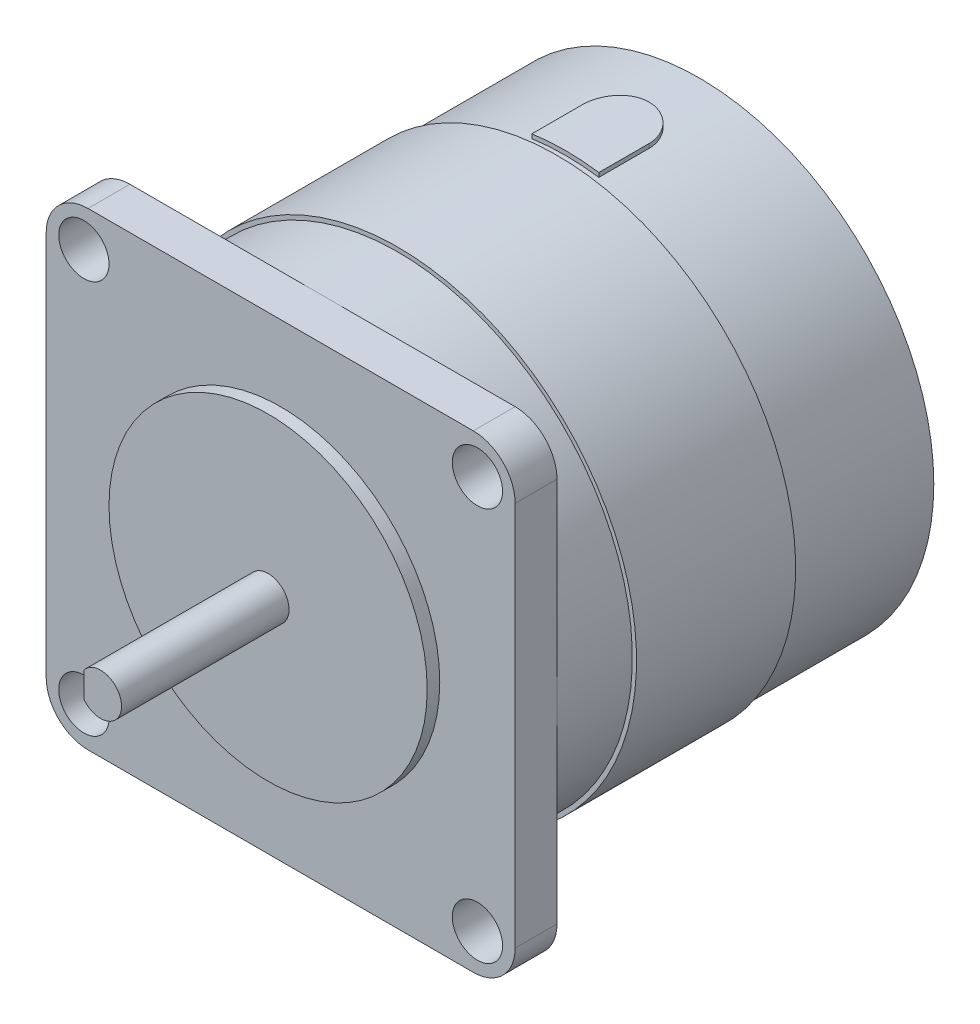
ISO-10303-21;
HEADER;
FILE_DESCRIPTION(('STEP AP214'),'2;1');
FILE_NAME('part.step','',(''),(''),'','','');
FILE_SCHEMA(('AUTOMOTIVE_DESIGN { 1 0 10303 214 1 1 1 1 }'));
ENDSEC;
DATA;
#1=APPLICATION_CONTEXT('core data for automotive mechanical design processes');
#2=APPLICATION_PROTOCOL_DEFINITION('international standard','automotive_design',2000,#1);
#3=PRODUCT_CONTEXT('',#1,'mechanical');
#4=PRODUCT('Part','Part','',(#3));
#5=PRODUCT_RELATED_PRODUCT_CATEGORY('part','',(#4));
#6=PRODUCT_DEFINITION_FORMATION('','',#4);
#7=PRODUCT_DEFINITION_CONTEXT('part definition',#1,'design');
#8=PRODUCT_DEFINITION('design','',#6,#7);
#9=PRODUCT_DEFINITION_SHAPE('','',#8);
#10=(LENGTH_UNIT() NAMED_UNIT(*) SI_UNIT(.MILLI.,.METRE.));
#11=(NAMED_UNIT(*) PLANE_ANGLE_UNIT() SI_UNIT($,.RADIAN.));
#12=(NAMED_UNIT(*) SI_UNIT($,.STERADIAN.) SOLID_ANGLE_UNIT());
#13=UNCERTAINTY_MEASURE_WITH_UNIT(LENGTH_MEASURE(1.E-05),#10,'distance_accuracy_value','');
#14=(GEOMETRIC_REPRESENTATION_CONTEXT(3) GLOBAL_UNCERTAINTY_ASSIGNED_CONTEXT((#13)) GLOBAL_UNIT_ASSIGNED_CONTEXT((#10,
#11,#12)) REPRESENTATION_CONTEXT('',''));
#15=CARTESIAN_POINT('',(0.,0.,0.));
#16=DIRECTION('',(0.,0.,1.));
#17=DIRECTION('',(1.,0.,0.));
#18=AXIS2_PLACEMENT_3D('',#15,#16,#17);
#19=CARTESIAN_POINT('',(0.,0.,45.));
#20=DIRECTION('',(0.,0.,-1.));
#21=DIRECTION('',(-1.,0.,0.));
#22=AXIS2_PLACEMENT_3D('',#19,#20,#21);
#23=CYLINDRICAL_SURFACE('',#22,28.);
#24=CARTESIAN_POINT('',(0.,0.,17.));
#25=DIRECTION('',(0.,0.,1.));
#26=DIRECTION('',(1.,0.,0.));
#27=AXIS2_PLACEMENT_3D('',#24,#25,#26);
#28=CIRCLE('',#27,28.);
#29=CARTESIAN_POINT('',(28.,0.,17.));
#30=VERTEX_POINT('',#29);
#31=EDGE_CURVE('E242',#30,#30,#28,.T.);
#32=ORIENTED_EDGE('',*,*,#31,.F.);
#33=EDGE_LOOP('',(#32));
#34=FACE_BOUND('',#33,.T.);
#35=CARTESIAN_POINT('',(0.,0.,0.));
#36=DIRECTION('',(0.,0.,1.));
#37=DIRECTION('',(1.,0.,0.));
#38=AXIS2_PLACEMENT_3D('',#35,#36,#37);
#39=CIRCLE('',#38,28.);
#40=CARTESIAN_POINT('',(28.,0.,0.));
#41=VERTEX_POINT('',#40);
#42=EDGE_CURVE('E254',#41,#41,#39,.T.);
#43=ORIENTED_EDGE('',*,*,#42,.T.);
#44=EDGE_LOOP('',(#43));
#45=FACE_BOUND('',#44,.T.);
#46=CARTESIAN_POINT('',(0.,28.,6.));
#47=CARTESIAN_POINT('',(-0.223461458825642,27.9999965409153,6.00000930635524));
#48=CARTESIAN_POINT('',(-0.447055621982067,27.9972968080118,6.0187888286376));
#49=CARTESIAN_POINT('',(-0.888002641472323,27.9867868202351,6.09339654493597));
#50=CARTESIAN_POINT('',(-1.10534906213391,27.9789714798523,6.14926160708152));
#51=CARTESIAN_POINT('',(-1.52735470714177,27.9591092064729,6.29634424693691));
#52=CARTESIAN_POINT('',(-1.73202307739908,27.9470653667318,6.38753598730602));
#53=CARTESIAN_POINT('',(-2.12311860096127,27.9200795632234,6.60262217158142));
#54=CARTESIAN_POINT('',(-2.3095484617546,27.9051380306009,6.72651175139832));
#55=CARTESIAN_POINT('',(-2.66023460158925,27.8739015648356,7.00441668466906));
#56=CARTESIAN_POINT('',(-2.8243423632026,27.8575986306991,7.15861857143165));
#57=CARTESIAN_POINT('',(-3.12444516707451,27.8255399928487,7.49236965815862));
#58=CARTESIAN_POINT('',(-3.26043865083479,27.8097843195122,7.67192026238608));
#59=CARTESIAN_POINT('',(-3.50102350568891,27.7805262596274,8.05226046421501));
#60=CARTESIAN_POINT('',(-3.60547250189553,27.7670342079851,8.25314098514061));
#61=CARTESIAN_POINT('',(-3.77909380667239,27.7439393062515,8.66981815796421));
#62=CARTESIAN_POINT('',(-3.84826785817993,27.7343362640087,8.88561407229329));
#63=CARTESIAN_POINT('',(-3.94891728024467,27.7201847750637,9.32444003931207));
#64=CARTESIAN_POINT('',(-3.98064595411181,27.7156023809441,9.54741087971129));
#65=CARTESIAN_POINT('',(-4.00628840030274,27.7119077538169,9.99555562173919));
#66=CARTESIAN_POINT('',(-4.00020414507916,27.7127952354817,10.2207294078429));
#67=CARTESIAN_POINT('',(-3.95060072391764,27.7199090308412,10.6651061813323));
#68=CARTESIAN_POINT('',(-3.90736272718597,27.7260952440848,10.8843412881834));
#69=CARTESIAN_POINT('',(-3.78511889285714,27.7430468675803,11.312412345137));
#70=CARTESIAN_POINT('',(-3.70611212989925,27.7538123963016,11.5212480260447));
#71=CARTESIAN_POINT('',(-3.51427808499815,27.7787543094111,11.9234530924337));
#72=CARTESIAN_POINT('',(-3.40133077246536,27.7929427632502,12.1167644495432));
#73=CARTESIAN_POINT('',(-3.14490738288152,27.8231229556026,12.4817968487572));
#74=CARTESIAN_POINT('',(-3.00142948605021,27.8391148015806,12.6535166029198));
#75=CARTESIAN_POINT('',(-2.68646983485756,27.871277427218,12.9721216124585));
#76=CARTESIAN_POINT('',(-2.51474615031044,27.8874485153813,13.1187677802398));
#77=CARTESIAN_POINT('',(-2.14899663760356,27.9180127158238,13.381194004893));
#78=CARTESIAN_POINT('',(-1.95497072748996,27.932405821569,13.4969739483359));
#79=CARTESIAN_POINT('',(-1.54992415925538,27.9578054125388,13.6943897499972));
#80=CARTESIAN_POINT('',(-1.33889491093462,27.9688101722408,13.7760082189885));
#81=CARTESIAN_POINT('',(-0.90593339750839,27.9861783978407,13.902581877279));
#82=CARTESIAN_POINT('',(-0.684001801262564,27.9925421480863,13.9475393127636));
#83=CARTESIAN_POINT('',(-0.237600044779892,27.9998738914547,13.9991992536409));
#84=CARTESIAN_POINT('',(-0.013168679084783,28.0008882724896,14.006230652937));
#85=CARTESIAN_POINT('',(0.43366970062659,27.997532945354,13.9827103839598));
#86=CARTESIAN_POINT('',(0.656076771152115,27.9931633879463,13.9521597680698));
#87=CARTESIAN_POINT('',(1.09156483596897,27.979559874646,13.8546161168106));
#88=CARTESIAN_POINT('',(1.30468220984024,27.9703471746018,13.7877822816409));
#89=CARTESIAN_POINT('',(1.71668588804936,27.9480874854487,13.6197365214092));
#90=CARTESIAN_POINT('',(1.91557157816216,27.9350403309726,13.5185231136417));
#91=CARTESIAN_POINT('',(2.29491939159571,27.9064475434187,13.2838123660251));
#92=CARTESIAN_POINT('',(2.47525042539594,27.8908858969841,13.1501051405891));
#93=CARTESIAN_POINT('',(2.81103058960972,27.8590489286155,12.8544958478955));
#94=CARTESIAN_POINT('',(2.96647841415716,27.8427735692829,12.6925923018307));
#95=CARTESIAN_POINT('',(3.24926729241534,27.8111976033941,12.3437265980711));
#96=CARTESIAN_POINT('',(3.37638860169675,27.7959052309702,12.156585459399));
#97=CARTESIAN_POINT('',(3.59739137507829,27.7681694296162,11.763413626792));
#98=CARTESIAN_POINT('',(3.69127367010166,27.7557259294716,11.5573834052168));
#99=CARTESIAN_POINT('',(3.84278821517066,27.7351554052352,11.1329533909874));
#100=CARTESIAN_POINT('',(3.90053860263941,27.7270143275847,10.9145964823174));
#101=CARTESIAN_POINT('',(3.97852746400306,27.7159321852887,10.4711588778888));
#102=CARTESIAN_POINT('',(3.99876826786038,27.7129907976574,10.2460786006446));
#103=CARTESIAN_POINT('',(4.00111180748421,27.7126523549015,9.79777234695742));
#104=CARTESIAN_POINT('',(3.98355994735612,27.7152050864635,9.57454813668937));
#105=CARTESIAN_POINT('',(3.91155391701599,27.7254584842396,9.13425975188307));
#106=CARTESIAN_POINT('',(3.85709978482701,27.7331591451494,8.91719557099794));
#107=CARTESIAN_POINT('',(3.71295291131592,27.7528237895503,8.49546946977763));
#108=CARTESIAN_POINT('',(3.62328205925203,27.7647851243538,8.29079993647391));
#109=CARTESIAN_POINT('',(3.41128128406175,27.7916269145477,7.89935511009318));
#110=CARTESIAN_POINT('',(3.28895046383679,27.8065074501192,7.71258030873721));
#111=CARTESIAN_POINT('',(3.0138389492619,27.8376732530578,7.36046836294217));
#112=CARTESIAN_POINT('',(2.8608018588073,27.853969645273,7.19533250959552));
#113=CARTESIAN_POINT('',(2.5291630266423,27.8860364410813,6.89296058513554));
#114=CARTESIAN_POINT('',(2.35055532866988,27.9018067210666,6.75573103242301));
#115=CARTESIAN_POINT('',(1.97180684906769,27.9311332498513,6.51246485592771));
#116=CARTESIAN_POINT('',(1.7715634349086,27.9446781023906,6.40658669168421));
#117=CARTESIAN_POINT('',(1.35604257674007,27.9679151214977,6.2301205119878));
#118=CARTESIAN_POINT('',(1.14078121039796,27.9776113360616,6.15949539713523));
#119=CARTESIAN_POINT('',(0.770422727995114,27.9898072601009,6.07183282617475));
#120=CARTESIAN_POINT('',(0.617627798357146,27.9936102171292,6.04493592612351));
#121=CARTESIAN_POINT('',(0.309909842731325,27.9987077731558,6.00901638182359));
#122=CARTESIAN_POINT('',(0.154986839646123,28.0000023991278,5.99999354536305));
#123=CARTESIAN_POINT('',(0.,28.,6.));
#124=B_SPLINE_CURVE_WITH_KNOTS('',3,(#46,#47,#48,#49,#50,#51,#52,#53,#54,#55,#56,#57,#58,#59,
#60,#61,#62,#63,#64,#65,#66,#67,#68,#69,#70,#71,#72,#73,#74,#75,#76,#77,#78,#79,#80,#81,#82,#83,
#84,#85,#86,#87,#88,#89,#90,#91,#92,#93,#94,#95,#96,#97,#98,#99,#100,#101,#102,#103,#104,#105,
#106,#107,#108,#109,#110,#111,#112,#113,#114,#115,#116,#117,#118,#119,#120,#121,#122,#123),
.UNSPECIFIED.,.T.,.F.,(4,2,2,2,2,2,2,2,2,2,2,2,2,2,2,2,2,2,2,2,2,2,2,2,2,2,2,2,2,2,2,2,2,2,2,2,
2,2,4),(0.,0.669818106705754,1.34030310398334,2.01029864278741,2.68019457002068,
3.35434973715227,4.02854226565975,4.7057337617023,5.38289179442632,6.05544237283908,
6.72795786899117,7.39542833159442,8.06291606306981,8.73279271243798,9.40270930109858,
10.0786951341339,10.7546834512892,11.4310154497532,12.107306006905,12.7777222417217,
13.4481197037612,14.1155991547388,14.7831073960998,15.4550475197326,16.1270228951033,
16.8040424944938,17.4810451682605,18.155822574817,18.830558065187,19.4991530369424,
20.1677473197976,20.8359266881017,21.5041244117341,22.1781529501895,22.8523387489822,
23.5298760999862,24.2066989169227,24.6712716823152,25.1358394518162),.UNSPECIFIED.);
#125=CARTESIAN_POINT('',(4.,27.712812921102,9.99999999999999));
#126=VERTEX_POINT('',#125);
#127=CARTESIAN_POINT('',(-4.,27.712812921102,9.99999999999999));
#128=VERTEX_POINT('',#127);
#129=EDGE_CURVE('E12',#126,#128,#124,.T.);
#130=ORIENTED_EDGE('',*,*,#129,.F.);
#131=DIRECTION('',(0.,0.,-1.));
#132=VECTOR('',#131,1.);
#133=CARTESIAN_POINT('',(4.,27.712812921102,45.));
#134=LINE('',#133,#132);
#135=CARTESIAN_POINT('',(4.,27.712812921102,16.));
#136=VERTEX_POINT('',#135);
#137=EDGE_CURVE('E53',#136,#126,#134,.T.);
#138=ORIENTED_EDGE('',*,*,#137,.F.);
#139=CARTESIAN_POINT('',(0.,0.,16.));
#140=DIRECTION('',(0.,0.,-1.));
#141=DIRECTION('',(-1.,0.,0.));
#142=AXIS2_PLACEMENT_3D('',#139,#140,#141);
#143=CIRCLE('',#142,28.);
#144=CARTESIAN_POINT('',(-4.,27.712812921102,16.));
#145=VERTEX_POINT('',#144);
#146=EDGE_CURVE('E314',#145,#136,#143,.T.);
#147=ORIENTED_EDGE('',*,*,#146,.F.);
#148=DIRECTION('',(0.,0.,-1.));
#149=VECTOR('',#148,1.);
#150=CARTESIAN_POINT('',(-4.,27.712812921102,45.));
#151=LINE('',#150,#149);
#152=EDGE_CURVE('E310',#128,#145,#151,.F.);
#153=ORIENTED_EDGE('',*,*,#152,.F.);
#154=EDGE_LOOP('',(#130,#138,#147,#153));
#155=FACE_BOUND('',#154,.T.);
#156=ADVANCED_FACE('F40',(#34,#45,#155),#23,.T.);
#157=CARTESIAN_POINT('',(0.,0.,51.5));
#158=DIRECTION('',(0.,0.,1.));
#159=DIRECTION('',(1.,0.,0.));
#160=AXIS2_PLACEMENT_3D('',#157,#158,#159);
#161=PLANE('',#160);
#162=CARTESIAN_POINT('',(0.,0.,51.5));
#163=DIRECTION('',(0.,0.,1.));
#164=DIRECTION('',(1.,0.,0.));
#165=AXIS2_PLACEMENT_3D('',#162,#163,#164);
#166=CIRCLE('',#165,19.);
#167=CARTESIAN_POINT('',(19.,0.,51.5));
#168=VERTEX_POINT('',#167);
#169=EDGE_CURVE('E323',#168,#168,#166,.T.);
#170=ORIENTED_EDGE('',*,*,#169,.T.);
#171=EDGE_LOOP('',(#170));
#172=FACE_BOUND('',#171,.T.);
#173=CARTESIAN_POINT('',(0.,0.,51.5));
#174=DIRECTION('',(0.,0.,1.));
#175=DIRECTION('',(1.,0.,0.));
#176=AXIS2_PLACEMENT_3D('',#173,#174,#175);
#177=CIRCLE('',#176,2.5);
#178=CARTESIAN_POINT('',(2.5,0.,51.5));
#179=VERTEX_POINT('',#178);
#180=EDGE_CURVE('E377',#179,#179,#177,.T.);
#181=ORIENTED_EDGE('',*,*,#180,.F.);
#182=EDGE_LOOP('',(#181));
#183=FACE_BOUND('',#182,.T.);
#184=ADVANCED_FACE('F203',(#172,#183),#161,.T.);
#185=CARTESIAN_POINT('',(28.,-28.,50.));
#186=DIRECTION('',(0.,0.,1.));
#187=DIRECTION('',(1.,0.,0.));
#188=AXIS2_PLACEMENT_3D('',#185,#186,#187);
#189=PLANE('',#188);
#190=DIRECTION('',(0.,-1.,0.));
#191=VECTOR('',#190,1.);
#192=CARTESIAN_POINT('',(-28.,28.,50.));
#193=LINE('',#192,#191);
#194=CARTESIAN_POINT('',(-28.,23.,50.));
#195=VERTEX_POINT('',#194);
#196=CARTESIAN_POINT('',(-28.,-23.,50.));
#197=VERTEX_POINT('',#196);
#198=EDGE_CURVE('E329',#195,#197,#193,.T.);
#199=ORIENTED_EDGE('',*,*,#198,.T.);
#200=CARTESIAN_POINT('',(-23.,-23.,50.));
#201=DIRECTION('',(0.,0.,1.));
#202=DIRECTION('',(1.,0.,0.));
#203=AXIS2_PLACEMENT_3D('',#200,#201,#202);
#204=CIRCLE('',#203,5.);
#205=CARTESIAN_POINT('',(-23.,-28.,50.));
#206=VERTEX_POINT('',#205);
#207=EDGE_CURVE('E285',#197,#206,#204,.T.);
#208=ORIENTED_EDGE('',*,*,#207,.T.);
#209=DIRECTION('',(1.,0.,0.));
#210=VECTOR('',#209,1.);
#211=CARTESIAN_POINT('',(-28.,-28.,50.));
#212=LINE('',#211,#210);
#213=CARTESIAN_POINT('',(23.,-28.,50.));
#214=VERTEX_POINT('',#213);
#215=EDGE_CURVE('E331',#206,#214,#212,.T.);
#216=ORIENTED_EDGE('',*,*,#215,.T.);
#217=CARTESIAN_POINT('',(23.,-23.,50.));
#218=DIRECTION('',(0.,0.,1.));
#219=DIRECTION('',(1.,0.,0.));
#220=AXIS2_PLACEMENT_3D('',#217,#218,#219);
#221=CIRCLE('',#220,5.);
#222=CARTESIAN_POINT('',(28.,-23.,50.));
#223=VERTEX_POINT('',#222);
#224=EDGE_CURVE('E282',#214,#223,#221,.T.);
#225=ORIENTED_EDGE('',*,*,#224,.T.);
#226=DIRECTION('',(0.,1.,0.));
#227=VECTOR('',#226,1.);
#228=CARTESIAN_POINT('',(28.,28.,50.));
#229=LINE('',#228,#227);
#230=CARTESIAN_POINT('',(28.,23.,50.));
#231=VERTEX_POINT('',#230);
#232=EDGE_CURVE('E344',#223,#231,#229,.T.);
#233=ORIENTED_EDGE('',*,*,#232,.T.);
#234=CARTESIAN_POINT('',(23.,23.,50.));
#235=DIRECTION('',(0.,0.,1.));
#236=DIRECTION('',(1.,0.,0.));
#237=AXIS2_PLACEMENT_3D('',#234,#235,#236);
#238=CIRCLE('',#237,5.);
#239=CARTESIAN_POINT('',(23.,28.,50.));
#240=VERTEX_POINT('',#239);
#241=EDGE_CURVE('E279',#231,#240,#238,.T.);
#242=ORIENTED_EDGE('',*,*,#241,.T.);
#243=DIRECTION('',(-1.,0.,0.));
#244=VECTOR('',#243,1.);
#245=CARTESIAN_POINT('',(-28.,28.,50.));
#246=LINE('',#245,#244);
#247=CARTESIAN_POINT('',(-23.,28.,50.));
#248=VERTEX_POINT('',#247);
#249=EDGE_CURVE('E332',#240,#248,#246,.T.);
#250=ORIENTED_EDGE('',*,*,#249,.T.);
#251=CARTESIAN_POINT('',(-23.,23.,50.));
#252=DIRECTION('',(0.,0.,1.));
#253=DIRECTION('',(1.,0.,0.));
#254=AXIS2_PLACEMENT_3D('',#251,#252,#253);
#255=CIRCLE('',#254,5.);
#256=EDGE_CURVE('E276',#248,#195,#255,.T.);
#257=ORIENTED_EDGE('',*,*,#256,.T.);
#258=EDGE_LOOP('',(#199,#208,#216,#225,#233,#242,#250,#257));
#259=FACE_BOUND('',#258,.T.);
#260=CARTESIAN_POINT('',(-23.5,23.5,50.));
#261=DIRECTION('',(0.,0.,1.));
#262=DIRECTION('',(1.,0.,0.));
#263=AXIS2_PLACEMENT_3D('',#260,#261,#262);
#264=CIRCLE('',#263,3.);
#265=CARTESIAN_POINT('',(-20.5,23.5,50.));
#266=VERTEX_POINT('',#265);
#267=EDGE_CURVE('E367',#266,#266,#264,.T.);
#268=ORIENTED_EDGE('',*,*,#267,.F.);
#269=EDGE_LOOP('',(#268));
#270=FACE_BOUND('',#269,.T.);
#271=CARTESIAN_POINT('',(23.5,23.5,50.));
#272=DIRECTION('',(0.,0.,1.));
#273=DIRECTION('',(1.,0.,0.));
#274=AXIS2_PLACEMENT_3D('',#271,#272,#273);
#275=CIRCLE('',#274,3.);
#276=CARTESIAN_POINT('',(26.5,23.5,50.));
#277=VERTEX_POINT('',#276);
#278=EDGE_CURVE('E341',#277,#277,#275,.T.);
#279=ORIENTED_EDGE('',*,*,#278,.F.);
#280=EDGE_LOOP('',(#279));
#281=FACE_BOUND('',#280,.T.);
#282=CARTESIAN_POINT('',(-23.5,-23.5,50.));
#283=DIRECTION('',(0.,0.,1.));
#284=DIRECTION('',(1.,0.,0.));
#285=AXIS2_PLACEMENT_3D('',#282,#283,#284);
#286=CIRCLE('',#285,3.);
#287=CARTESIAN_POINT('',(-20.5,-23.5,50.));
#288=VERTEX_POINT('',#287);
#289=EDGE_CURVE('E342',#288,#288,#286,.T.);
#290=ORIENTED_EDGE('',*,*,#289,.F.);
#291=EDGE_LOOP('',(#290));
#292=FACE_BOUND('',#291,.T.);
#293=CARTESIAN_POINT('',(23.5,-23.5,50.));
#294=DIRECTION('',(0.,0.,1.));
#295=DIRECTION('',(1.,0.,0.));
#296=AXIS2_PLACEMENT_3D('',#293,#294,#295);
#297=CIRCLE('',#296,3.);
#298=CARTESIAN_POINT('',(26.5,-23.5,50.));
#299=VERTEX_POINT('',#298);
#300=EDGE_CURVE('E319',#299,#299,#297,.T.);
#301=ORIENTED_EDGE('',*,*,#300,.F.);
#302=EDGE_LOOP('',(#301));
#303=FACE_BOUND('',#302,.T.);
#304=CARTESIAN_POINT('',(0.,0.,50.));
#305=DIRECTION('',(0.,0.,1.));
#306=DIRECTION('',(1.,0.,0.));
#307=AXIS2_PLACEMENT_3D('',#304,#305,#306);
#308=CIRCLE('',#307,19.);
#309=CARTESIAN_POINT('',(19.,0.,50.));
#310=VERTEX_POINT('',#309);
#311=EDGE_CURVE('E354',#310,#310,#308,.T.);
#312=ORIENTED_EDGE('',*,*,#311,.F.);
#313=EDGE_LOOP('',(#312));
#314=FACE_BOUND('',#313,.T.);
#315=ADVANCED_FACE('F209',(#259,#270,#281,#292,#303,#314),#189,.T.);
#316=CARTESIAN_POINT('',(0.,0.,45.));
#317=DIRECTION('',(0.,0.,1.));
#318=DIRECTION('',(1.,0.,0.));
#319=AXIS2_PLACEMENT_3D('',#316,#317,#318);
#320=CIRCLE('',#319,28.);
#321=CARTESIAN_POINT('',(28.,0.,45.));
#322=VERTEX_POINT('',#321);
#323=CARTESIAN_POINT('',(0.,28.,45.));
#324=VERTEX_POINT('',#323);
#325=EDGE_CURVE('E235',#322,#324,#320,.T.);
#326=ORIENTED_EDGE('',*,*,#325,.F.);
#327=CARTESIAN_POINT('',(0.,-28.,45.));
#328=VERTEX_POINT('',#327);
#329=EDGE_CURVE('E252',#328,#322,#320,.T.);
#330=ORIENTED_EDGE('',*,*,#329,.F.);
#331=CARTESIAN_POINT('',(-28.,0.,45.));
#332=VERTEX_POINT('',#331);
#333=EDGE_CURVE('E326',#332,#328,#320,.T.);
#334=ORIENTED_EDGE('',*,*,#333,.F.);
#335=EDGE_CURVE('E250',#324,#332,#320,.T.);
#336=ORIENTED_EDGE('',*,*,#335,.F.);
#337=EDGE_LOOP('',(#326,#330,#334,#336));
#338=FACE_BOUND('',#337,.T.);
#339=CARTESIAN_POINT('',(0.,0.,36.));
#340=DIRECTION('',(0.,0.,-1.));
#341=DIRECTION('',(-1.,0.,0.));
#342=AXIS2_PLACEMENT_3D('',#339,#340,#341);
#343=CIRCLE('',#342,28.);
#344=CARTESIAN_POINT('',(-28.,0.,36.));
#345=VERTEX_POINT('',#344);
#346=EDGE_CURVE('E239',#345,#345,#343,.T.);
#347=ORIENTED_EDGE('',*,*,#346,.F.);
#348=EDGE_LOOP('',(#347));
#349=FACE_BOUND('',#348,.T.);
#350=ADVANCED_FACE('F205',(#338,#349),#23,.T.);
#351=CARTESIAN_POINT('',(28.,-28.,45.));
#352=DIRECTION('',(0.,0.,1.));
#353=DIRECTION('',(1.,0.,0.));
#354=AXIS2_PLACEMENT_3D('',#351,#352,#353);
#355=PLANE('',#354);
#356=CARTESIAN_POINT('',(23.5,23.5,45.));
#357=DIRECTION('',(0.,0.,1.));
#358=DIRECTION('',(1.,0.,0.));
#359=AXIS2_PLACEMENT_3D('',#356,#357,#358);
#360=CIRCLE('',#359,3.);
#361=CARTESIAN_POINT('',(26.5,23.5,45.));
#362=VERTEX_POINT('',#361);
#363=EDGE_CURVE('E364',#362,#362,#360,.T.);
#364=ORIENTED_EDGE('',*,*,#363,.T.);
#365=EDGE_LOOP('',(#364));
#366=FACE_BOUND('',#365,.T.);
#367=DIRECTION('',(-1.,0.,0.));
#368=VECTOR('',#367,1.);
#369=CARTESIAN_POINT('',(-28.,28.,45.));
#370=LINE('',#369,#368);
#371=CARTESIAN_POINT('',(23.,28.,45.));
#372=VERTEX_POINT('',#371);
#373=EDGE_CURVE('E391',#372,#324,#370,.T.);
#374=ORIENTED_EDGE('',*,*,#373,.F.);
#375=CARTESIAN_POINT('',(23.,23.,45.));
#376=DIRECTION('',(0.,0.,1.));
#377=DIRECTION('',(1.,0.,0.));
#378=AXIS2_PLACEMENT_3D('',#375,#376,#377);
#379=CIRCLE('',#378,5.);
#380=CARTESIAN_POINT('',(28.,23.,45.));
#381=VERTEX_POINT('',#380);
#382=EDGE_CURVE('E304',#372,#381,#379,.F.);
#383=ORIENTED_EDGE('',*,*,#382,.T.);
#384=DIRECTION('',(0.,1.,0.));
#385=VECTOR('',#384,1.);
#386=CARTESIAN_POINT('',(28.,28.,45.));
#387=LINE('',#386,#385);
#388=EDGE_CURVE('E372',#322,#381,#387,.T.);
#389=ORIENTED_EDGE('',*,*,#388,.F.);
#390=ORIENTED_EDGE('',*,*,#325,.T.);
#391=EDGE_LOOP('',(#374,#383,#389,#390));
#392=FACE_BOUND('',#391,.T.);
#393=ADVANCED_FACE('F218',(#366,#392),#355,.F.);
#394=CARTESIAN_POINT('',(-23.5,23.5,45.));
#395=DIRECTION('',(0.,0.,1.));
#396=DIRECTION('',(1.,0.,0.));
#397=AXIS2_PLACEMENT_3D('',#394,#395,#396);
#398=CIRCLE('',#397,3.);
#399=CARTESIAN_POINT('',(-20.5,23.5,45.));
#400=VERTEX_POINT('',#399);
#401=EDGE_CURVE('E381',#400,#400,#398,.T.);
#402=ORIENTED_EDGE('',*,*,#401,.T.);
#403=EDGE_LOOP('',(#402));
#404=FACE_BOUND('',#403,.T.);
#405=DIRECTION('',(0.,-1.,0.));
#406=VECTOR('',#405,1.);
#407=CARTESIAN_POINT('',(-28.,28.,45.));
#408=LINE('',#407,#406);
#409=CARTESIAN_POINT('',(-28.,23.,45.));
#410=VERTEX_POINT('',#409);
#411=EDGE_CURVE('E352',#410,#332,#408,.T.);
#412=ORIENTED_EDGE('',*,*,#411,.F.);
#413=CARTESIAN_POINT('',(-23.,23.,45.));
#414=DIRECTION('',(0.,0.,1.));
#415=DIRECTION('',(1.,0.,0.));
#416=AXIS2_PLACEMENT_3D('',#413,#414,#415);
#417=CIRCLE('',#416,5.);
#418=CARTESIAN_POINT('',(-23.,28.,45.));
#419=VERTEX_POINT('',#418);
#420=EDGE_CURVE('E307',#410,#419,#417,.F.);
#421=ORIENTED_EDGE('',*,*,#420,.T.);
#422=EDGE_CURVE('E371',#324,#419,#370,.T.);
#423=ORIENTED_EDGE('',*,*,#422,.F.);
#424=ORIENTED_EDGE('',*,*,#335,.T.);
#425=EDGE_LOOP('',(#412,#421,#423,#424));
#426=FACE_BOUND('',#425,.T.);
#427=ADVANCED_FACE('F224',(#404,#426),#355,.F.);
#428=CARTESIAN_POINT('',(-23.5,-23.5,45.));
#429=DIRECTION('',(0.,0.,1.));
#430=DIRECTION('',(1.,0.,0.));
#431=AXIS2_PLACEMENT_3D('',#428,#429,#430);
#432=CIRCLE('',#431,3.);
#433=CARTESIAN_POINT('',(-20.5,-23.5,45.));
#434=VERTEX_POINT('',#433);
#435=EDGE_CURVE('E338',#434,#434,#432,.T.);
#436=ORIENTED_EDGE('',*,*,#435,.T.);
#437=EDGE_LOOP('',(#436));
#438=FACE_BOUND('',#437,.T.);
#439=DIRECTION('',(1.,0.,0.));
#440=VECTOR('',#439,1.);
#441=CARTESIAN_POINT('',(-28.,-28.,45.));
#442=LINE('',#441,#440);
#443=CARTESIAN_POINT('',(-23.,-28.,45.));
#444=VERTEX_POINT('',#443);
#445=EDGE_CURVE('E347',#444,#328,#442,.T.);
#446=ORIENTED_EDGE('',*,*,#445,.F.);
#447=CARTESIAN_POINT('',(-23.,-23.,45.));
#448=DIRECTION('',(0.,0.,1.));
#449=DIRECTION('',(1.,0.,0.));
#450=AXIS2_PLACEMENT_3D('',#447,#448,#449);
#451=CIRCLE('',#450,5.);
#452=CARTESIAN_POINT('',(-28.,-23.,45.));
#453=VERTEX_POINT('',#452);
#454=EDGE_CURVE('E266',#444,#453,#451,.F.);
#455=ORIENTED_EDGE('',*,*,#454,.T.);
#456=EDGE_CURVE('E388',#332,#453,#408,.T.);
#457=ORIENTED_EDGE('',*,*,#456,.F.);
#458=ORIENTED_EDGE('',*,*,#333,.T.);
#459=EDGE_LOOP('',(#446,#455,#457,#458));
#460=FACE_BOUND('',#459,.T.);
#461=ADVANCED_FACE('F445',(#438,#460),#355,.F.);
#462=CARTESIAN_POINT('',(23.5,-23.5,45.));
#463=DIRECTION('',(0.,0.,1.));
#464=DIRECTION('',(1.,0.,0.));
#465=AXIS2_PLACEMENT_3D('',#462,#463,#464);
#466=CIRCLE('',#465,3.);
#467=CARTESIAN_POINT('',(26.5,-23.5,45.));
#468=VERTEX_POINT('',#467);
#469=EDGE_CURVE('E407',#468,#468,#466,.T.);
#470=ORIENTED_EDGE('',*,*,#469,.T.);
#471=EDGE_LOOP('',(#470));
#472=FACE_BOUND('',#471,.T.);
#473=CARTESIAN_POINT('',(28.,-23.,45.));
#474=VERTEX_POINT('',#473);
#475=EDGE_CURVE('E369',#474,#322,#387,.T.);
#476=ORIENTED_EDGE('',*,*,#475,.F.);
#477=CARTESIAN_POINT('',(23.,-23.,45.));
#478=DIRECTION('',(0.,0.,1.));
#479=DIRECTION('',(1.,0.,0.));
#480=AXIS2_PLACEMENT_3D('',#477,#478,#479);
#481=CIRCLE('',#480,5.);
#482=CARTESIAN_POINT('',(23.,-28.,45.));
#483=VERTEX_POINT('',#482);
#484=EDGE_CURVE('E294',#474,#483,#481,.F.);
#485=ORIENTED_EDGE('',*,*,#484,.T.);
#486=EDGE_CURVE('E349',#328,#483,#442,.T.);
#487=ORIENTED_EDGE('',*,*,#486,.F.);
#488=ORIENTED_EDGE('',*,*,#329,.T.);
#489=EDGE_LOOP('',(#476,#485,#487,#488));
#490=FACE_BOUND('',#489,.T.);
#491=ADVANCED_FACE('F227',(#472,#490),#355,.F.);
#492=CARTESIAN_POINT('',(28.,28.,50.));
#493=DIRECTION('',(-1.,0.,0.));
#494=DIRECTION('',(0.,-1.,0.));
#495=AXIS2_PLACEMENT_3D('',#492,#493,#494);
#496=PLANE('',#495);
#497=ORIENTED_EDGE('',*,*,#232,.F.);
#498=DIRECTION('',(0.,0.,-1.));
#499=VECTOR('',#498,1.);
#500=CARTESIAN_POINT('',(28.,-23.,50.));
#501=LINE('',#500,#499);
#502=EDGE_CURVE('E290',#223,#474,#501,.T.);
#503=ORIENTED_EDGE('',*,*,#502,.T.);
#504=ORIENTED_EDGE('',*,*,#475,.T.);
#505=ORIENTED_EDGE('',*,*,#388,.T.);
#506=DIRECTION('',(0.,0.,-1.));
#507=VECTOR('',#506,1.);
#508=CARTESIAN_POINT('',(28.,23.,50.));
#509=LINE('',#508,#507);
#510=EDGE_CURVE('E287',#381,#231,#509,.F.);
#511=ORIENTED_EDGE('',*,*,#510,.T.);
#512=EDGE_LOOP('',(#497,#503,#504,#505,#511));
#513=FACE_BOUND('',#512,.T.);
#514=ADVANCED_FACE('F452',(#513),#496,.F.);
#515=CARTESIAN_POINT('',(-28.,28.,50.));
#516=DIRECTION('',(0.,-1.,0.));
#517=DIRECTION('',(0.,0.,-1.));
#518=AXIS2_PLACEMENT_3D('',#515,#516,#517);
#519=PLANE('',#518);
#520=ORIENTED_EDGE('',*,*,#249,.F.);
#521=DIRECTION('',(0.,0.,-1.));
#522=VECTOR('',#521,1.);
#523=CARTESIAN_POINT('',(23.,28.,50.));
#524=LINE('',#523,#522);
#525=EDGE_CURVE('E300',#240,#372,#524,.T.);
#526=ORIENTED_EDGE('',*,*,#525,.T.);
#527=ORIENTED_EDGE('',*,*,#373,.T.);
#528=ORIENTED_EDGE('',*,*,#422,.T.);
#529=DIRECTION('',(0.,0.,-1.));
#530=VECTOR('',#529,1.);
#531=CARTESIAN_POINT('',(-23.,28.,50.));
#532=LINE('',#531,#530);
#533=EDGE_CURVE('E297',#419,#248,#532,.F.);
#534=ORIENTED_EDGE('',*,*,#533,.T.);
#535=EDGE_LOOP('',(#520,#526,#527,#528,#534));
#536=FACE_BOUND('',#535,.T.);
#537=ADVANCED_FACE('F462',(#536),#519,.F.);
#538=CARTESIAN_POINT('',(-28.,28.,50.));
#539=DIRECTION('',(1.,0.,0.));
#540=DIRECTION('',(0.,1.,0.));
#541=AXIS2_PLACEMENT_3D('',#538,#539,#540);
#542=PLANE('',#541);
#543=ORIENTED_EDGE('',*,*,#456,.T.);
#544=DIRECTION('',(0.,0.,-1.));
#545=VECTOR('',#544,1.);
#546=CARTESIAN_POINT('',(-28.,-23.,50.));
#547=LINE('',#546,#545);
#548=EDGE_CURVE('E273',#453,#197,#547,.F.);
#549=ORIENTED_EDGE('',*,*,#548,.T.);
#550=ORIENTED_EDGE('',*,*,#198,.F.);
#551=DIRECTION('',(0.,0.,-1.));
#552=VECTOR('',#551,1.);
#553=CARTESIAN_POINT('',(-28.,23.,50.));
#554=LINE('',#553,#552);
#555=EDGE_CURVE('E269',#195,#410,#554,.T.);
#556=ORIENTED_EDGE('',*,*,#555,.T.);
#557=ORIENTED_EDGE('',*,*,#411,.T.);
#558=EDGE_LOOP('',(#543,#549,#550,#556,#557));
#559=FACE_BOUND('',#558,.T.);
#560=ADVANCED_FACE('F535',(#559),#542,.F.);
#561=CARTESIAN_POINT('',(-28.,-28.,50.));
#562=DIRECTION('',(0.,1.,0.));
#563=DIRECTION('',(0.,0.,1.));
#564=AXIS2_PLACEMENT_3D('',#561,#562,#563);
#565=PLANE('',#564);
#566=ORIENTED_EDGE('',*,*,#215,.F.);
#567=DIRECTION('',(0.,0.,-1.));
#568=VECTOR('',#567,1.);
#569=CARTESIAN_POINT('',(-23.,-28.,50.));
#570=LINE('',#569,#568);
#571=EDGE_CURVE('E262',#206,#444,#570,.T.);
#572=ORIENTED_EDGE('',*,*,#571,.T.);
#573=ORIENTED_EDGE('',*,*,#445,.T.);
#574=ORIENTED_EDGE('',*,*,#486,.T.);
#575=DIRECTION('',(0.,0.,-1.));
#576=VECTOR('',#575,1.);
#577=CARTESIAN_POINT('',(23.,-28.,50.));
#578=LINE('',#577,#576);
#579=EDGE_CURVE('E259',#483,#214,#578,.F.);
#580=ORIENTED_EDGE('',*,*,#579,.T.);
#581=EDGE_LOOP('',(#566,#572,#573,#574,#580));
#582=FACE_BOUND('',#581,.T.);
#583=ADVANCED_FACE('F435',(#582),#565,.F.);
#584=CARTESIAN_POINT('',(-23.5,23.5,45.));
#585=DIRECTION('',(0.,0.,1.));
#586=DIRECTION('',(1.,0.,0.));
#587=AXIS2_PLACEMENT_3D('',#584,#585,#586);
#588=CYLINDRICAL_SURFACE('',#587,3.);
#589=ORIENTED_EDGE('',*,*,#401,.F.);
#590=EDGE_LOOP('',(#589));
#591=FACE_BOUND('',#590,.T.);
#592=ORIENTED_EDGE('',*,*,#267,.T.);
#593=EDGE_LOOP('',(#592));
#594=FACE_BOUND('',#593,.T.);
#595=ADVANCED_FACE('F528',(#591,#594),#588,.F.);
#596=CARTESIAN_POINT('',(23.5,23.5,45.));
#597=DIRECTION('',(0.,0.,1.));
#598=DIRECTION('',(1.,0.,0.));
#599=AXIS2_PLACEMENT_3D('',#596,#597,#598);
#600=CYLINDRICAL_SURFACE('',#599,3.);
#601=ORIENTED_EDGE('',*,*,#363,.F.);
#602=EDGE_LOOP('',(#601));
#603=FACE_BOUND('',#602,.T.);
#604=ORIENTED_EDGE('',*,*,#278,.T.);
#605=EDGE_LOOP('',(#604));
#606=FACE_BOUND('',#605,.T.);
#607=ADVANCED_FACE('F524',(#603,#606),#600,.F.);
#608=CARTESIAN_POINT('',(-23.5,-23.5,45.));
#609=DIRECTION('',(0.,0.,1.));
#610=DIRECTION('',(1.,0.,0.));
#611=AXIS2_PLACEMENT_3D('',#608,#609,#610);
#612=CYLINDRICAL_SURFACE('',#611,3.);
#613=ORIENTED_EDGE('',*,*,#435,.F.);
#614=EDGE_LOOP('',(#613));
#615=FACE_BOUND('',#614,.T.);
#616=ORIENTED_EDGE('',*,*,#289,.T.);
#617=EDGE_LOOP('',(#616));
#618=FACE_BOUND('',#617,.T.);
#619=ADVANCED_FACE('F520',(#615,#618),#612,.F.);
#620=CARTESIAN_POINT('',(23.5,-23.5,45.));
#621=DIRECTION('',(0.,0.,1.));
#622=DIRECTION('',(1.,0.,0.));
#623=AXIS2_PLACEMENT_3D('',#620,#621,#622);
#624=CYLINDRICAL_SURFACE('',#623,3.);
#625=ORIENTED_EDGE('',*,*,#469,.F.);
#626=EDGE_LOOP('',(#625));
#627=FACE_BOUND('',#626,.T.);
#628=ORIENTED_EDGE('',*,*,#300,.T.);
#629=EDGE_LOOP('',(#628));
#630=FACE_BOUND('',#629,.T.);
#631=ADVANCED_FACE('F516',(#627,#630),#624,.F.);
#632=CARTESIAN_POINT('',(0.,0.,0.));
#633=DIRECTION('',(0.,0.,-1.));
#634=DIRECTION('',(-1.,0.,0.));
#635=AXIS2_PLACEMENT_3D('',#632,#633,#634);
#636=CYLINDRICAL_SURFACE('',#635,28.5);
#637=CARTESIAN_POINT('',(0.,0.,17.));
#638=DIRECTION('',(0.,0.,-1.));
#639=DIRECTION('',(-1.,0.,0.));
#640=AXIS2_PLACEMENT_3D('',#637,#638,#639);
#641=CIRCLE('',#640,28.5);
#642=CARTESIAN_POINT('',(-28.5,0.,17.));
#643=VERTEX_POINT('',#642);
#644=EDGE_CURVE('E322',#643,#643,#641,.T.);
#645=ORIENTED_EDGE('',*,*,#644,.F.);
#646=EDGE_LOOP('',(#645));
#647=FACE_BOUND('',#646,.T.);
#648=CARTESIAN_POINT('',(0.,0.,36.));
#649=DIRECTION('',(0.,0.,-1.));
#650=DIRECTION('',(-1.,0.,0.));
#651=AXIS2_PLACEMENT_3D('',#648,#649,#650);
#652=CIRCLE('',#651,28.5);
#653=CARTESIAN_POINT('',(-28.5,0.,36.));
#654=VERTEX_POINT('',#653);
#655=EDGE_CURVE('E320',#654,#654,#652,.T.);
#656=ORIENTED_EDGE('',*,*,#655,.T.);
#657=EDGE_LOOP('',(#656));
#658=FACE_BOUND('',#657,.T.);
#659=ADVANCED_FACE('F512',(#647,#658),#636,.T.);
#660=CARTESIAN_POINT('',(28.5,0.,17.));
#661=DIRECTION('',(0.,0.,1.));
#662=DIRECTION('',(1.,0.,0.));
#663=AXIS2_PLACEMENT_3D('',#660,#661,#662);
#664=PLANE('',#663);
#665=ORIENTED_EDGE('',*,*,#31,.T.);
#666=EDGE_LOOP('',(#665));
#667=FACE_BOUND('',#666,.T.);
#668=ORIENTED_EDGE('',*,*,#644,.T.);
#669=EDGE_LOOP('',(#668));
#670=FACE_BOUND('',#669,.T.);
#671=ADVANCED_FACE('F508',(#667,#670),#664,.F.);
#672=CARTESIAN_POINT('',(28.5,0.,36.));
#673=DIRECTION('',(0.,0.,-1.));
#674=DIRECTION('',(-1.,0.,0.));
#675=AXIS2_PLACEMENT_3D('',#672,#673,#674);
#676=PLANE('',#675);
#677=ORIENTED_EDGE('',*,*,#655,.F.);
#678=EDGE_LOOP('',(#677));
#679=FACE_BOUND('',#678,.T.);
#680=ORIENTED_EDGE('',*,*,#346,.T.);
#681=EDGE_LOOP('',(#680));
#682=FACE_BOUND('',#681,.T.);
#683=ADVANCED_FACE('F505',(#679,#682),#676,.F.);
#684=CARTESIAN_POINT('',(0.,0.,0.));
#685=DIRECTION('',(0.,0.,1.));
#686=DIRECTION('',(1.,0.,0.));
#687=AXIS2_PLACEMENT_3D('',#684,#685,#686);
#688=PLANE('',#687);
#689=ORIENTED_EDGE('',*,*,#42,.F.);
#690=EDGE_LOOP('',(#689));
#691=FACE_BOUND('',#690,.T.);
#692=ADVANCED_FACE('F503',(#691),#688,.F.);
#693=CARTESIAN_POINT('',(0.,0.,51.5));
#694=DIRECTION('',(0.,0.,-1.));
#695=DIRECTION('',(-1.,0.,0.));
#696=AXIS2_PLACEMENT_3D('',#693,#694,#695);
#697=CYLINDRICAL_SURFACE('',#696,19.);
#698=ORIENTED_EDGE('',*,*,#169,.F.);
#699=EDGE_LOOP('',(#698));
#700=FACE_BOUND('',#699,.T.);
#701=ORIENTED_EDGE('',*,*,#311,.T.);
#702=EDGE_LOOP('',(#701));
#703=FACE_BOUND('',#702,.T.);
#704=ADVANCED_FACE('F498',(#700,#703),#697,.T.);
#705=CARTESIAN_POINT('',(0.,0.,71.5));
#706=DIRECTION('',(0.,0.,-1.));
#707=DIRECTION('',(-1.,0.,0.));
#708=AXIS2_PLACEMENT_3D('',#705,#706,#707);
#709=CYLINDRICAL_SURFACE('',#708,2.5);
#710=CARTESIAN_POINT('',(0.,0.,71.5));
#711=DIRECTION('',(0.,0.,1.));
#712=DIRECTION('',(1.,0.,0.));
#713=AXIS2_PLACEMENT_3D('',#710,#711,#712);
#714=CIRCLE('',#713,2.5);
#715=CARTESIAN_POINT('',(-2.,-1.5,71.5));
#716=VERTEX_POINT('',#715);
#717=CARTESIAN_POINT('',(-2.,1.5,71.5));
#718=VERTEX_POINT('',#717);
#719=EDGE_CURVE('E356',#716,#718,#714,.T.);
#720=ORIENTED_EDGE('',*,*,#719,.F.);
#721=DIRECTION('',(0.,0.,1.));
#722=VECTOR('',#721,1.);
#723=CARTESIAN_POINT('',(-2.,-1.5,61.5));
#724=LINE('',#723,#722);
#725=CARTESIAN_POINT('',(-2.,-1.5,61.5));
#726=VERTEX_POINT('',#725);
#727=EDGE_CURVE('E396',#726,#716,#724,.T.);
#728=ORIENTED_EDGE('',*,*,#727,.F.);
#729=CARTESIAN_POINT('',(0.,0.,61.5));
#730=DIRECTION('',(0.,0.,-1.));
#731=DIRECTION('',(-1.,0.,0.));
#732=AXIS2_PLACEMENT_3D('',#729,#730,#731);
#733=CIRCLE('',#732,2.5);
#734=CARTESIAN_POINT('',(-2.,1.5,61.5));
#735=VERTEX_POINT('',#734);
#736=EDGE_CURVE('E248',#726,#735,#733,.T.);
#737=ORIENTED_EDGE('',*,*,#736,.T.);
#738=DIRECTION('',(0.,0.,1.));
#739=VECTOR('',#738,1.);
#740=CARTESIAN_POINT('',(-2.,1.5,61.5));
#741=LINE('',#740,#739);
#742=EDGE_CURVE('E386',#735,#718,#741,.T.);
#743=ORIENTED_EDGE('',*,*,#742,.T.);
#744=EDGE_LOOP('',(#720,#728,#737,#743));
#745=FACE_BOUND('',#744,.T.);
#746=ORIENTED_EDGE('',*,*,#180,.T.);
#747=EDGE_LOOP('',(#746));
#748=FACE_BOUND('',#747,.T.);
#749=ADVANCED_FACE('F495',(#745,#748),#709,.T.);
#750=CARTESIAN_POINT('',(0.,0.,71.5));
#751=DIRECTION('',(0.,0.,1.));
#752=DIRECTION('',(1.,0.,0.));
#753=AXIS2_PLACEMENT_3D('',#750,#751,#752);
#754=PLANE('',#753);
#755=DIRECTION('',(0.,1.,0.));
#756=VECTOR('',#755,1.);
#757=CARTESIAN_POINT('',(-2.,1.5,71.5));
#758=LINE('',#757,#756);
#759=EDGE_CURVE('E387',#716,#718,#758,.T.);
#760=ORIENTED_EDGE('',*,*,#759,.F.);
#761=ORIENTED_EDGE('',*,*,#719,.T.);
#762=EDGE_LOOP('',(#760,#761));
#763=FACE_BOUND('',#762,.T.);
#764=ADVANCED_FACE('F487',(#763),#754,.T.);
#765=CARTESIAN_POINT('',(-2.,-1.5,61.5));
#766=DIRECTION('',(0.,0.,-1.));
#767=DIRECTION('',(-1.,0.,0.));
#768=AXIS2_PLACEMENT_3D('',#765,#766,#767);
#769=PLANE('',#768);
#770=DIRECTION('',(0.,1.,0.));
#771=VECTOR('',#770,1.);
#772=CARTESIAN_POINT('',(-2.,1.5,61.5));
#773=LINE('',#772,#771);
#774=EDGE_CURVE('E189',#726,#735,#773,.T.);
#775=ORIENTED_EDGE('',*,*,#774,.T.);
#776=ORIENTED_EDGE('',*,*,#736,.F.);
#777=EDGE_LOOP('',(#775,#776));
#778=FACE_BOUND('',#777,.T.);
#779=ADVANCED_FACE('F483',(#778),#769,.F.);
#780=CARTESIAN_POINT('',(-2.,1.5,61.5));
#781=DIRECTION('',(1.,0.,0.));
#782=DIRECTION('',(0.,0.,-1.));
#783=AXIS2_PLACEMENT_3D('',#780,#781,#782);
#784=PLANE('',#783);
#785=ORIENTED_EDGE('',*,*,#759,.T.);
#786=ORIENTED_EDGE('',*,*,#742,.F.);
#787=ORIENTED_EDGE('',*,*,#774,.F.);
#788=ORIENTED_EDGE('',*,*,#727,.T.);
#789=EDGE_LOOP('',(#785,#786,#787,#788));
#790=FACE_BOUND('',#789,.T.);
#791=ADVANCED_FACE('F486',(#790),#784,.F.);
#792=CARTESIAN_POINT('',(-23.,-23.,50.));
#793=DIRECTION('',(0.,0.,-1.));
#794=DIRECTION('',(-1.,0.,0.));
#795=AXIS2_PLACEMENT_3D('',#792,#793,#794);
#796=CYLINDRICAL_SURFACE('',#795,5.);
#797=ORIENTED_EDGE('',*,*,#207,.F.);
#798=ORIENTED_EDGE('',*,*,#548,.F.);
#799=ORIENTED_EDGE('',*,*,#454,.F.);
#800=ORIENTED_EDGE('',*,*,#571,.F.);
#801=EDGE_LOOP('',(#797,#798,#799,#800));
#802=FACE_BOUND('',#801,.T.);
#803=ADVANCED_FACE('F491',(#802),#796,.T.);
#804=CARTESIAN_POINT('',(23.,-23.,50.));
#805=DIRECTION('',(0.,0.,-1.));
#806=DIRECTION('',(-1.,0.,0.));
#807=AXIS2_PLACEMENT_3D('',#804,#805,#806);
#808=CYLINDRICAL_SURFACE('',#807,5.);
#809=ORIENTED_EDGE('',*,*,#224,.F.);
#810=ORIENTED_EDGE('',*,*,#579,.F.);
#811=ORIENTED_EDGE('',*,*,#484,.F.);
#812=ORIENTED_EDGE('',*,*,#502,.F.);
#813=EDGE_LOOP('',(#809,#810,#811,#812));
#814=FACE_BOUND('',#813,.T.);
#815=ADVANCED_FACE('F449',(#814),#808,.T.);
#816=CARTESIAN_POINT('',(23.,23.,50.));
#817=DIRECTION('',(0.,0.,-1.));
#818=DIRECTION('',(-1.,0.,0.));
#819=AXIS2_PLACEMENT_3D('',#816,#817,#818);
#820=CYLINDRICAL_SURFACE('',#819,5.);
#821=ORIENTED_EDGE('',*,*,#241,.F.);
#822=ORIENTED_EDGE('',*,*,#510,.F.);
#823=ORIENTED_EDGE('',*,*,#382,.F.);
#824=ORIENTED_EDGE('',*,*,#525,.F.);
#825=EDGE_LOOP('',(#821,#822,#823,#824));
#826=FACE_BOUND('',#825,.T.);
#827=ADVANCED_FACE('F459',(#826),#820,.T.);
#828=CARTESIAN_POINT('',(-23.,23.,50.));
#829=DIRECTION('',(0.,0.,-1.));
#830=DIRECTION('',(-1.,0.,0.));
#831=AXIS2_PLACEMENT_3D('',#828,#829,#830);
#832=CYLINDRICAL_SURFACE('',#831,5.);
#833=ORIENTED_EDGE('',*,*,#256,.F.);
#834=ORIENTED_EDGE('',*,*,#533,.F.);
#835=ORIENTED_EDGE('',*,*,#420,.F.);
#836=ORIENTED_EDGE('',*,*,#555,.F.);
#837=EDGE_LOOP('',(#833,#834,#835,#836));
#838=FACE_BOUND('',#837,.T.);
#839=ADVANCED_FACE('F42',(#838),#832,.T.);
#840=CARTESIAN_POINT('',(0.,29.501,10.));
#841=DIRECTION('',(0.,-1.,0.));
#842=DIRECTION('',(0.,0.,-1.));
#843=AXIS2_PLACEMENT_3D('',#840,#841,#842);
#844=CYLINDRICAL_SURFACE('',#843,4.);
#845=DIRECTION('',(0.,-1.,0.));
#846=VECTOR('',#845,1.);
#847=CARTESIAN_POINT('',(4.,29.501,10.));
#848=LINE('',#847,#846);
#849=CARTESIAN_POINT('',(4.,28.2179021190449,10.));
#850=VERTEX_POINT('',#849);
#851=EDGE_CURVE('E166',#850,#126,#848,.T.);
#852=ORIENTED_EDGE('',*,*,#851,.T.);
#853=ORIENTED_EDGE('',*,*,#129,.T.);
#854=DIRECTION('',(0.,-1.,0.));
#855=VECTOR('',#854,1.);
#856=CARTESIAN_POINT('',(-4.,29.501,10.));
#857=LINE('',#856,#855);
#858=CARTESIAN_POINT('',(-4.,28.2179021190449,10.));
#859=VERTEX_POINT('',#858);
#860=EDGE_CURVE('E171',#859,#128,#857,.T.);
#861=ORIENTED_EDGE('',*,*,#860,.F.);
#862=CARTESIAN_POINT('',(0.,28.5,6.));
#863=CARTESIAN_POINT('',(0.223503581118078,28.4999965852582,6.00000933772395));
#864=CARTESIAN_POINT('',(0.447140922621583,28.4973432090117,6.0187959048189));
#865=CARTESIAN_POINT('',(0.888175975474692,28.4870136711539,6.09343324840776));
#866=CARTESIAN_POINT('',(1.10556720406958,28.4793324747899,6.14932117821822));
#867=CARTESIAN_POINT('',(1.52766262020202,28.4598113605289,6.2964680263606));
#868=CARTESIAN_POINT('',(1.73237584846631,28.4479744472128,6.38770139488023));
#869=CARTESIAN_POINT('',(2.12355251872033,28.4214533361894,6.6028894699092));
#870=CARTESIAN_POINT('',(2.31001873052825,28.4067695716338,6.72683919962228));
#871=CARTESIAN_POINT('',(2.66072468969964,28.3760774126018,7.00485068596445));
#872=CARTESIAN_POINT('',(2.82482082305307,28.3600614331576,7.15909279030492));
#873=CARTESIAN_POINT('',(3.12489032449142,28.3285700312815,7.4929227986168));
#874=CARTESIAN_POINT('',(3.26086215289099,28.3130946384828,7.67251208933321));
#875=CARTESIAN_POINT('',(3.50137299871701,28.2843626939361,8.05289124675888));
#876=CARTESIAN_POINT('',(3.605774784607,28.2711159373391,8.25376868779839));
#877=CARTESIAN_POINT('',(3.77930523737757,28.2484434481748,8.67042360210683));
#878=CARTESIAN_POINT('',(3.84843558638724,28.239017533392,8.88620036425534));
#879=CARTESIAN_POINT('',(3.94901850699027,28.2251278105506,9.32502579086823));
#880=CARTESIAN_POINT('',(3.98071568875764,28.2206318015849,9.54801735088288));
#881=CARTESIAN_POINT('',(4.00628993770273,28.2170129157667,9.99619637971204));
#882=CARTESIAN_POINT('',(4.00016891031974,28.217889768207,10.2213837373223));
#883=CARTESIAN_POINT('',(3.95048075341493,28.224888071393,10.6658436787067));
#884=CARTESIAN_POINT('',(3.90718483394204,28.2309715361798,10.8851472660576));
#885=CARTESIAN_POINT('',(3.78479988818199,28.2476383184645,11.3133456347281));
#886=CARTESIAN_POINT('',(3.70570996541809,28.2582217486655,11.5222401552025));
#887=CARTESIAN_POINT('',(3.51369618739459,28.2827384004512,11.9245228783244));
#888=CARTESIAN_POINT('',(3.40065624619009,28.2966830824017,12.1178549449271));
#889=CARTESIAN_POINT('',(3.14403403964947,28.3263425263853,12.4829090202349));
#890=CARTESIAN_POINT('',(3.00045001632915,28.3420573902778,12.6546297841818));
#891=CARTESIAN_POINT('',(2.6853209114745,28.3736548050624,12.9731595416331));
#892=CARTESIAN_POINT('',(2.51354240737352,28.3895376210721,13.11973767691));
#893=CARTESIAN_POINT('',(2.1476993623979,28.4195534223808,13.3820178678445));
#894=CARTESIAN_POINT('',(1.95363474462699,28.4336864016418,13.4977198169619));
#895=CARTESIAN_POINT('',(1.54853713944557,28.4586223233204,13.6949703683742));
#896=CARTESIAN_POINT('',(1.33749604030279,28.4694236617473,13.7765025266647));
#897=CARTESIAN_POINT('',(0.904532517141844,28.4864654802867,13.9029055200812));
#898=CARTESIAN_POINT('',(0.682610737217592,28.4927062300211,13.9477785225158));
#899=CARTESIAN_POINT('',(0.236179335552373,28.4998882753534,13.999285611558));
#900=CARTESIAN_POINT('',(0.0117070427401944,28.5008735902825,14.0062373366189));
#901=CARTESIAN_POINT('',(-0.435199743122095,28.4975531768913,13.9825456703756));
#902=CARTESIAN_POINT('',(-0.657634291032917,28.4932475914383,13.9519032942042));
#903=CARTESIAN_POINT('',(-1.09319947461904,28.4798564287026,13.8541572976567));
#904=CARTESIAN_POINT('',(-1.30636520919515,28.4707909685058,13.7872070894889));
#905=CARTESIAN_POINT('',(-1.71844516814432,28.4488938706987,13.6189067485232));
#906=CARTESIAN_POINT('',(-1.91735879632342,28.4360620756494,13.5175551776641));
#907=CARTESIAN_POINT('',(-2.29669378519658,28.4079504758242,13.2825744450298));
#908=CARTESIAN_POINT('',(-2.47698817994566,28.3926554785983,13.1487421691709));
#909=CARTESIAN_POINT('',(-2.81267035236503,28.3613709216487,12.8528836615548));
#910=CARTESIAN_POINT('',(-2.96805687053673,28.3453813268537,12.6908560049256));
#911=CARTESIAN_POINT('',(-3.25065655314185,28.3143716307947,12.3417979579596));
#912=CARTESIAN_POINT('',(-3.37765773510536,28.2993593813682,12.1545951434092));
#913=CARTESIAN_POINT('',(-3.59841186502839,28.2721392109983,11.7613278556147));
#914=CARTESIAN_POINT('',(-3.69216562064469,28.2599312219355,11.5552638407057));
#915=CARTESIAN_POINT('',(-3.84342902359696,28.2397573892067,11.130776719971));
#916=CARTESIAN_POINT('',(-3.90105345581083,28.2317781232821,10.9123951826924));
#917=CARTESIAN_POINT('',(-3.97878966875802,28.220928387945,10.4689347319112));
#918=CARTESIAN_POINT('',(-3.99890369175632,28.2180576131619,10.2438562195518));
#919=CARTESIAN_POINT('',(-4.00099973012908,28.2177603159646,9.7955021104083));
#920=CARTESIAN_POINT('',(-3.98331491699988,28.2202862253077,9.57222803058932));
#921=CARTESIAN_POINT('',(-3.91102582445212,28.2303947656965,9.13186137918312));
#922=CARTESIAN_POINT('',(-3.85642157627979,28.2379773924626,8.91476880236443));
#923=CARTESIAN_POINT('',(-3.71195600729637,28.2573291453442,8.49300035065788));
#924=CARTESIAN_POINT('',(-3.62211505810708,28.2690958521241,8.28831738012646));
#925=CARTESIAN_POINT('',(-3.40975918127477,28.2954932894009,7.89687663768049));
#926=CARTESIAN_POINT('',(-3.28724342763171,28.310124092298,7.71011931907832));
#927=CARTESIAN_POINT('',(-3.01179441438391,28.3407551834293,7.35813395304732));
#928=CARTESIAN_POINT('',(-2.85861366262434,28.3567659679414,7.19310047705004));
#929=CARTESIAN_POINT('',(-2.52670470327134,28.3882632951673,6.89095952172586));
#930=CARTESIAN_POINT('',(-2.34797053516581,28.4037497145241,6.75385857600056));
#931=CARTESIAN_POINT('',(-1.9690286122752,28.432537276304,6.51089683569258));
#932=CARTESIAN_POINT('',(-1.7687220308158,28.4458275877694,6.40518894090954));
#933=CARTESIAN_POINT('',(-1.35311345260237,28.468618237529,6.22906986187888));
#934=CARTESIAN_POINT('',(-1.13782757452289,28.4781225778884,6.15862138537176));
#935=CARTESIAN_POINT('',(-0.767927825389761,28.4900510336573,6.07136418762723));
#936=CARTESIAN_POINT('',(-0.615618547613511,28.4937631399094,6.04464250981031));
#937=CARTESIAN_POINT('',(-0.308894132044871,28.4987387906602,6.00895727970668));
#938=CARTESIAN_POINT('',(-0.154479015777367,28.5000023601678,5.99999354604343));
#939=CARTESIAN_POINT('',(0.,28.5,6.));
#940=B_SPLINE_CURVE_WITH_KNOTS('',3,(#862,#863,#864,#865,#866,#867,#868,#869,#870,#871,#872,
#873,#874,#875,#876,#877,#878,#879,#880,#881,#882,#883,#884,#885,#886,#887,#888,#889,#890,#891,
#892,#893,#894,#895,#896,#897,#898,#899,#900,#901,#902,#903,#904,#905,#906,#907,#908,#909,#910,
#911,#912,#913,#914,#915,#916,#917,#918,#919,#920,#921,#922,#923,#924,#925,#926,#927,#928,#929,
#930,#931,#932,#933,#934,#935,#936,#937,#938,#939),.UNSPECIFIED.,.T.,.F.,(4,2,2,2,2,2,2,2,2,2,2,
2,2,2,2,2,2,2,2,2,2,2,2,2,2,2,2,2,2,2,2,2,2,2,2,2,2,2,4),(0.,0.669946352028542,1.34056460260108,
2.0106989916841,2.68073149895553,3.35488111633691,4.0290676307621,4.7061439719448,
5.38318801968015,6.05578294561118,6.72834398367789,7.39603963226777,8.06375200451774,
8.73377400706453,9.40383458359588,10.0797517780291,10.755671304725,11.4319157411039,
12.1081201946652,12.7786517861439,13.4491652720255,14.1168674504433,14.7845975438845,
15.456615958316,16.1286683435047,16.8055833483162,17.4824819081721,18.1572188786837,
18.8319155140558,19.5006896876345,20.1694632952066,20.8378508289484,21.5062552607397,
22.1802891354447,22.8544804905325,23.5319035793682,24.2086086669507,24.6716603533684,
25.1347073102327),.UNSPECIFIED.);
#941=EDGE_CURVE('E156',#859,#850,#940,.T.);
#942=ORIENTED_EDGE('',*,*,#941,.T.);
#943=EDGE_LOOP('',(#852,#853,#861,#942));
#944=FACE_BOUND('',#943,.T.);
#945=ADVANCED_FACE('F174',(#944),#844,.T.);
#946=CARTESIAN_POINT('',(4.,29.501,16.));
#947=DIRECTION('',(-1.,0.,0.));
#948=DIRECTION('',(0.,0.,1.));
#949=AXIS2_PLACEMENT_3D('',#946,#947,#948);
#950=PLANE('',#949);
#951=DIRECTION('',(0.,-1.,0.));
#952=VECTOR('',#951,1.);
#953=CARTESIAN_POINT('',(4.,29.501,16.));
#954=LINE('',#953,#952);
#955=CARTESIAN_POINT('',(4.,28.2179021190449,16.));
#956=VERTEX_POINT('',#955);
#957=EDGE_CURVE('E170',#956,#136,#954,.T.);
#958=ORIENTED_EDGE('',*,*,#957,.T.);
#959=ORIENTED_EDGE('',*,*,#137,.T.);
#960=ORIENTED_EDGE('',*,*,#851,.F.);
#961=DIRECTION('',(0.,0.,-1.));
#962=VECTOR('',#961,1.);
#963=CARTESIAN_POINT('',(4.,28.2179021190449,45.));
#964=LINE('',#963,#962);
#965=EDGE_CURVE('E152',#850,#956,#964,.F.);
#966=ORIENTED_EDGE('',*,*,#965,.T.);
#967=EDGE_LOOP('',(#958,#959,#960,#966));
#968=FACE_BOUND('',#967,.T.);
#969=ADVANCED_FACE('F167',(#968),#950,.F.);
#970=CARTESIAN_POINT('',(-4.,29.501,16.));
#971=DIRECTION('',(0.,0.,-1.));
#972=DIRECTION('',(-1.,0.,0.));
#973=AXIS2_PLACEMENT_3D('',#970,#971,#972);
#974=PLANE('',#973);
#975=DIRECTION('',(0.,-1.,0.));
#976=VECTOR('',#975,1.);
#977=CARTESIAN_POINT('',(-4.,29.501,16.));
#978=LINE('',#977,#976);
#979=CARTESIAN_POINT('',(-4.,28.2179021190449,16.));
#980=VERTEX_POINT('',#979);
#981=EDGE_CURVE('E177',#980,#145,#978,.T.);
#982=ORIENTED_EDGE('',*,*,#981,.T.);
#983=ORIENTED_EDGE('',*,*,#146,.T.);
#984=ORIENTED_EDGE('',*,*,#957,.F.);
#985=CARTESIAN_POINT('',(0.,0.,16.));
#986=DIRECTION('',(0.,0.,-1.));
#987=DIRECTION('',(-1.,0.,0.));
#988=AXIS2_PLACEMENT_3D('',#985,#986,#987);
#989=CIRCLE('',#988,28.5);
#990=EDGE_CURVE('E159',#956,#980,#989,.F.);
#991=ORIENTED_EDGE('',*,*,#990,.T.);
#992=EDGE_LOOP('',(#982,#983,#984,#991));
#993=FACE_BOUND('',#992,.T.);
#994=ADVANCED_FACE('F199',(#993),#974,.F.);
#995=CARTESIAN_POINT('',(-4.,29.501,16.));
#996=DIRECTION('',(1.,0.,0.));
#997=DIRECTION('',(0.,0.,-1.));
#998=AXIS2_PLACEMENT_3D('',#995,#996,#997);
#999=PLANE('',#998);
#1000=ORIENTED_EDGE('',*,*,#860,.T.);
#1001=ORIENTED_EDGE('',*,*,#152,.T.);
#1002=ORIENTED_EDGE('',*,*,#981,.F.);
#1003=DIRECTION('',(0.,0.,-1.));
#1004=VECTOR('',#1003,1.);
#1005=CARTESIAN_POINT('',(-4.,28.2179021190449,45.));
#1006=LINE('',#1005,#1004);
#1007=EDGE_CURVE('E470',#980,#859,#1006,.T.);
#1008=ORIENTED_EDGE('',*,*,#1007,.T.);
#1009=EDGE_LOOP('',(#1000,#1001,#1002,#1008));
#1010=FACE_BOUND('',#1009,.T.);
#1011=ADVANCED_FACE('F195',(#1010),#999,.F.);
#1012=CARTESIAN_POINT('',(0.,0.,45.));
#1013=DIRECTION('',(0.,0.,-1.));
#1014=DIRECTION('',(-1.,0.,0.));
#1015=AXIS2_PLACEMENT_3D('',#1012,#1013,#1014);
#1016=CYLINDRICAL_SURFACE('',#1015,28.5);
#1017=ORIENTED_EDGE('',*,*,#990,.F.);
#1018=ORIENTED_EDGE('',*,*,#965,.F.);
#1019=ORIENTED_EDGE('',*,*,#941,.F.);
#1020=ORIENTED_EDGE('',*,*,#1007,.F.);
#1021=EDGE_LOOP('',(#1017,#1018,#1019,#1020));
#1022=FACE_BOUND('',#1021,.T.);
#1023=ADVANCED_FACE('F154',(#1022),#1016,.T.);
#1024=CLOSED_SHELL('',(#156,#184,#315,#350,#393,#427,#461,#491,#514,#537,#560,#583,#595,#607,
#619,#631,#659,#671,#683,#692,#704,#749,#764,#779,#791,#803,#815,#827,#839,#945,#969,#994,#1011,#1023));
#1025=MANIFOLD_SOLID_BREP('B2',#1024);
#1026=ADVANCED_BREP_SHAPE_REPRESENTATION('',(#18,#1025),#14);
#1027=SHAPE_DEFINITION_REPRESENTATION(#9,#1026);
ENDSEC;
END-ISO-10303-21;
